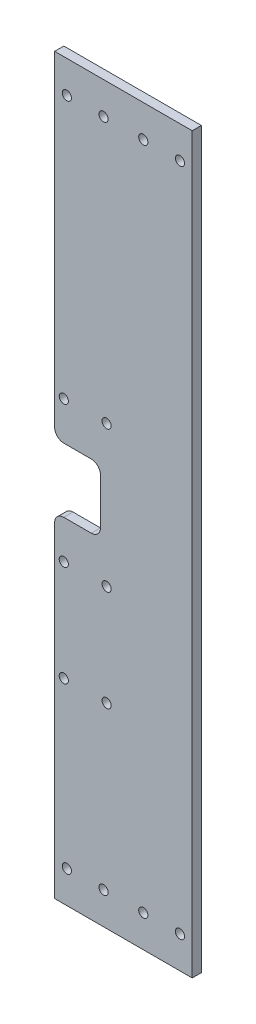
ISO-10303-21;
HEADER;
FILE_DESCRIPTION(('STEP AP214'),'2;1');
FILE_NAME('part.step','',(''),(''),'','','');
FILE_SCHEMA(('AUTOMOTIVE_DESIGN { 1 0 10303 214 1 1 1 1 }'));
ENDSEC;
DATA;
#1=APPLICATION_CONTEXT('core data for automotive mechanical design processes');
#2=APPLICATION_PROTOCOL_DEFINITION('international standard','automotive_design',2000,#1);
#3=PRODUCT_CONTEXT('',#1,'mechanical');
#4=PRODUCT('Part','Part','',(#3));
#5=PRODUCT_RELATED_PRODUCT_CATEGORY('part','',(#4));
#6=PRODUCT_DEFINITION_FORMATION('','',#4);
#7=PRODUCT_DEFINITION_CONTEXT('part definition',#1,'design');
#8=PRODUCT_DEFINITION('design','',#6,#7);
#9=PRODUCT_DEFINITION_SHAPE('','',#8);
#10=(LENGTH_UNIT() NAMED_UNIT(*) SI_UNIT(.MILLI.,.METRE.));
#11=(NAMED_UNIT(*) PLANE_ANGLE_UNIT() SI_UNIT($,.RADIAN.));
#12=(NAMED_UNIT(*) SI_UNIT($,.STERADIAN.) SOLID_ANGLE_UNIT());
#13=UNCERTAINTY_MEASURE_WITH_UNIT(LENGTH_MEASURE(1.E-05),#10,'distance_accuracy_value','');
#14=(GEOMETRIC_REPRESENTATION_CONTEXT(3) GLOBAL_UNCERTAINTY_ASSIGNED_CONTEXT((#13)) GLOBAL_UNIT_ASSIGNED_CONTEXT((#10,
#11,#12)) REPRESENTATION_CONTEXT('',''));
#15=CARTESIAN_POINT('',(0.,0.,0.));
#16=DIRECTION('',(0.,0.,1.));
#17=DIRECTION('',(1.,0.,0.));
#18=AXIS2_PLACEMENT_3D('',#15,#16,#17);
#19=CARTESIAN_POINT('',(2767.51034317599,-6.92406468480509E-11,3.));
#20=DIRECTION('',(1.,0.,0.));
#21=DIRECTION('',(0.,1.,0.));
#22=AXIS2_PLACEMENT_3D('',#19,#20,#21);
#23=PLANE('',#22);
#24=DIRECTION('',(0.,-1.,0.));
#25=VECTOR('',#24,1.);
#26=CARTESIAN_POINT('',(2767.51034317599,-6.92406468480509E-11,0.));
#27=LINE('',#26,#25);
#28=CARTESIAN_POINT('',(2767.51034317604,1970.7187101528,0.));
#29=VERTEX_POINT('',#28);
#30=CARTESIAN_POINT('',(2767.51034317604,1864.2187101528,0.));
#31=VERTEX_POINT('',#30);
#32=EDGE_CURVE('E195',#29,#31,#27,.T.);
#33=ORIENTED_EDGE('',*,*,#32,.T.);
#34=DIRECTION('',(0.,0.,-1.));
#35=VECTOR('',#34,1.);
#36=CARTESIAN_POINT('',(2767.51034317604,1864.2187101528,3.));
#37=LINE('',#36,#35);
#38=CARTESIAN_POINT('',(2767.51034317604,1864.2187101528,3.));
#39=VERTEX_POINT('',#38);
#40=EDGE_CURVE('E11',#39,#31,#37,.T.);
#41=ORIENTED_EDGE('',*,*,#40,.F.);
#42=DIRECTION('',(0.,-1.,0.));
#43=VECTOR('',#42,1.);
#44=CARTESIAN_POINT('',(2767.51034317599,-6.92406468480509E-11,3.));
#45=LINE('',#44,#43);
#46=CARTESIAN_POINT('',(2767.51034317604,1970.7187101528,3.));
#47=VERTEX_POINT('',#46);
#48=EDGE_CURVE('E289',#47,#39,#45,.T.);
#49=ORIENTED_EDGE('',*,*,#48,.F.);
#50=DIRECTION('',(0.,0.,-1.));
#51=VECTOR('',#50,1.);
#52=CARTESIAN_POINT('',(2767.51034317604,1970.7187101528,3.));
#53=LINE('',#52,#51);
#54=EDGE_CURVE('E53',#47,#29,#53,.T.);
#55=ORIENTED_EDGE('',*,*,#54,.T.);
#56=EDGE_LOOP('',(#33,#41,#49,#55));
#57=FACE_BOUND('',#56,.T.);
#58=ADVANCED_FACE('F34',(#57),#23,.F.);
#59=CARTESIAN_POINT('',(2770.51034317604,1864.2187101528,3.));
#60=DIRECTION('',(0.,0.,-1.));
#61=DIRECTION('',(-1.,0.,0.));
#62=AXIS2_PLACEMENT_3D('',#59,#60,#61);
#63=CYLINDRICAL_SURFACE('',#62,2.99999999999978);
#64=CARTESIAN_POINT('',(2770.51034317604,1864.2187101528,0.));
#65=DIRECTION('',(0.,0.,1.));
#66=DIRECTION('',(1.,0.,0.));
#67=AXIS2_PLACEMENT_3D('',#64,#65,#66);
#68=CIRCLE('',#67,2.99999999999978);
#69=CARTESIAN_POINT('',(2770.51034317604,1861.2187101528,0.));
#70=VERTEX_POINT('',#69);
#71=EDGE_CURVE('E197',#31,#70,#68,.T.);
#72=ORIENTED_EDGE('',*,*,#71,.T.);
#73=DIRECTION('',(0.,0.,-1.));
#74=VECTOR('',#73,1.);
#75=CARTESIAN_POINT('',(2770.51034317604,1861.2187101528,3.));
#76=LINE('',#75,#74);
#77=CARTESIAN_POINT('',(2770.51034317604,1861.2187101528,3.));
#78=VERTEX_POINT('',#77);
#79=EDGE_CURVE('E44',#78,#70,#76,.T.);
#80=ORIENTED_EDGE('',*,*,#79,.F.);
#81=CARTESIAN_POINT('',(2770.51034317604,1864.2187101528,3.));
#82=DIRECTION('',(0.,0.,1.));
#83=DIRECTION('',(1.,0.,0.));
#84=AXIS2_PLACEMENT_3D('',#81,#82,#83);
#85=CIRCLE('',#84,2.99999999999978);
#86=EDGE_CURVE('E103',#39,#78,#85,.T.);
#87=ORIENTED_EDGE('',*,*,#86,.F.);
#88=ORIENTED_EDGE('',*,*,#40,.T.);
#89=EDGE_LOOP('',(#72,#80,#87,#88));
#90=FACE_BOUND('',#89,.T.);
#91=ADVANCED_FACE('F333',(#90),#63,.T.);
#92=CARTESIAN_POINT('',(0.,1861.2187101528,3.));
#93=DIRECTION('',(0.,-1.,0.));
#94=DIRECTION('',(0.,0.,-1.));
#95=AXIS2_PLACEMENT_3D('',#92,#93,#94);
#96=PLANE('',#95);
#97=DIRECTION('',(-1.,0.,0.));
#98=VECTOR('',#97,1.);
#99=CARTESIAN_POINT('',(0.,1861.2187101528,0.));
#100=LINE('',#99,#98);
#101=CARTESIAN_POINT('',(2779.51034317604,1861.2187101528,0.));
#102=VERTEX_POINT('',#101);
#103=EDGE_CURVE('E200',#102,#70,#100,.T.);
#104=ORIENTED_EDGE('',*,*,#103,.F.);
#105=DIRECTION('',(0.,0.,-1.));
#106=VECTOR('',#105,1.);
#107=CARTESIAN_POINT('',(2779.51034317604,1861.2187101528,3.));
#108=LINE('',#107,#106);
#109=CARTESIAN_POINT('',(2779.51034317604,1861.2187101528,3.));
#110=VERTEX_POINT('',#109);
#111=EDGE_CURVE('E240',#110,#102,#108,.T.);
#112=ORIENTED_EDGE('',*,*,#111,.F.);
#113=DIRECTION('',(-1.,0.,0.));
#114=VECTOR('',#113,1.);
#115=CARTESIAN_POINT('',(0.,1861.2187101528,3.));
#116=LINE('',#115,#114);
#117=EDGE_CURVE('E292',#110,#78,#116,.T.);
#118=ORIENTED_EDGE('',*,*,#117,.T.);
#119=ORIENTED_EDGE('',*,*,#79,.T.);
#120=EDGE_LOOP('',(#104,#112,#118,#119));
#121=FACE_BOUND('',#120,.T.);
#122=ADVANCED_FACE('F338',(#121),#96,.T.);
#123=CARTESIAN_POINT('',(2779.51034317604,1858.2187101528,3.));
#124=DIRECTION('',(0.,0.,-1.));
#125=DIRECTION('',(-1.,0.,0.));
#126=AXIS2_PLACEMENT_3D('',#123,#124,#125);
#127=CYLINDRICAL_SURFACE('',#126,3.00000000000011);
#128=CARTESIAN_POINT('',(2779.51034317604,1858.2187101528,0.));
#129=DIRECTION('',(0.,0.,1.));
#130=DIRECTION('',(1.,0.,0.));
#131=AXIS2_PLACEMENT_3D('',#128,#129,#130);
#132=CIRCLE('',#131,3.00000000000011);
#133=CARTESIAN_POINT('',(2782.51034317604,1858.2187101528,0.));
#134=VERTEX_POINT('',#133);
#135=EDGE_CURVE('E203',#134,#102,#132,.T.);
#136=ORIENTED_EDGE('',*,*,#135,.F.);
#137=DIRECTION('',(0.,0.,-1.));
#138=VECTOR('',#137,1.);
#139=CARTESIAN_POINT('',(2782.51034317604,1858.2187101528,3.));
#140=LINE('',#139,#138);
#141=CARTESIAN_POINT('',(2782.51034317604,1858.2187101528,3.));
#142=VERTEX_POINT('',#141);
#143=EDGE_CURVE('E238',#142,#134,#140,.T.);
#144=ORIENTED_EDGE('',*,*,#143,.F.);
#145=CARTESIAN_POINT('',(2779.51034317604,1858.2187101528,3.));
#146=DIRECTION('',(0.,0.,1.));
#147=DIRECTION('',(1.,0.,0.));
#148=AXIS2_PLACEMENT_3D('',#145,#146,#147);
#149=CIRCLE('',#148,3.00000000000011);
#150=EDGE_CURVE('E295',#142,#110,#149,.T.);
#151=ORIENTED_EDGE('',*,*,#150,.T.);
#152=ORIENTED_EDGE('',*,*,#111,.T.);
#153=EDGE_LOOP('',(#136,#144,#151,#152));
#154=FACE_BOUND('',#153,.T.);
#155=ADVANCED_FACE('F617',(#154),#127,.F.);
#156=CARTESIAN_POINT('',(2782.51034317604,0.,3.));
#157=DIRECTION('',(1.,0.,0.));
#158=DIRECTION('',(0.,0.,-1.));
#159=AXIS2_PLACEMENT_3D('',#156,#157,#158);
#160=PLANE('',#159);
#161=DIRECTION('',(0.,-1.,0.));
#162=VECTOR('',#161,1.);
#163=CARTESIAN_POINT('',(2782.51034317604,0.,0.));
#164=LINE('',#163,#162);
#165=CARTESIAN_POINT('',(2782.51034317604,1843.2187101528,0.));
#166=VERTEX_POINT('',#165);
#167=EDGE_CURVE('E206',#134,#166,#164,.T.);
#168=ORIENTED_EDGE('',*,*,#167,.T.);
#169=DIRECTION('',(0.,0.,-1.));
#170=VECTOR('',#169,1.);
#171=CARTESIAN_POINT('',(2782.51034317604,1843.2187101528,3.));
#172=LINE('',#171,#170);
#173=CARTESIAN_POINT('',(2782.51034317604,1843.2187101528,3.));
#174=VERTEX_POINT('',#173);
#175=EDGE_CURVE('E236',#174,#166,#172,.T.);
#176=ORIENTED_EDGE('',*,*,#175,.F.);
#177=DIRECTION('',(0.,-1.,0.));
#178=VECTOR('',#177,1.);
#179=CARTESIAN_POINT('',(2782.51034317604,0.,3.));
#180=LINE('',#179,#178);
#181=EDGE_CURVE('E298',#142,#174,#180,.T.);
#182=ORIENTED_EDGE('',*,*,#181,.F.);
#183=ORIENTED_EDGE('',*,*,#143,.T.);
#184=EDGE_LOOP('',(#168,#176,#182,#183));
#185=FACE_BOUND('',#184,.T.);
#186=ADVANCED_FACE('F607',(#185),#160,.F.);
#187=CARTESIAN_POINT('',(2779.51034317604,1843.2187101528,3.));
#188=DIRECTION('',(0.,0.,-1.));
#189=DIRECTION('',(-1.,0.,0.));
#190=AXIS2_PLACEMENT_3D('',#187,#188,#189);
#191=CYLINDRICAL_SURFACE('',#190,3.00000000000011);
#192=CARTESIAN_POINT('',(2779.51034317604,1843.2187101528,0.));
#193=DIRECTION('',(0.,0.,1.));
#194=DIRECTION('',(1.,0.,0.));
#195=AXIS2_PLACEMENT_3D('',#192,#193,#194);
#196=CIRCLE('',#195,3.00000000000011);
#197=CARTESIAN_POINT('',(2779.51034317604,1840.2187101528,0.));
#198=VERTEX_POINT('',#197);
#199=EDGE_CURVE('E209',#198,#166,#196,.T.);
#200=ORIENTED_EDGE('',*,*,#199,.F.);
#201=DIRECTION('',(0.,0.,-1.));
#202=VECTOR('',#201,1.);
#203=CARTESIAN_POINT('',(2779.51034317604,1840.2187101528,3.));
#204=LINE('',#203,#202);
#205=CARTESIAN_POINT('',(2779.51034317604,1840.2187101528,3.));
#206=VERTEX_POINT('',#205);
#207=EDGE_CURVE('E234',#206,#198,#204,.T.);
#208=ORIENTED_EDGE('',*,*,#207,.F.);
#209=CARTESIAN_POINT('',(2779.51034317604,1843.2187101528,3.));
#210=DIRECTION('',(0.,0.,1.));
#211=DIRECTION('',(1.,0.,0.));
#212=AXIS2_PLACEMENT_3D('',#209,#210,#211);
#213=CIRCLE('',#212,3.00000000000011);
#214=EDGE_CURVE('E300',#206,#174,#213,.T.);
#215=ORIENTED_EDGE('',*,*,#214,.T.);
#216=ORIENTED_EDGE('',*,*,#175,.T.);
#217=EDGE_LOOP('',(#200,#208,#215,#216));
#218=FACE_BOUND('',#217,.T.);
#219=ADVANCED_FACE('F597',(#218),#191,.F.);
#220=CARTESIAN_POINT('',(0.,1840.2187101528,3.));
#221=DIRECTION('',(0.,-1.,0.));
#222=DIRECTION('',(0.,0.,-1.));
#223=AXIS2_PLACEMENT_3D('',#220,#221,#222);
#224=PLANE('',#223);
#225=DIRECTION('',(-1.,0.,0.));
#226=VECTOR('',#225,1.);
#227=CARTESIAN_POINT('',(0.,1840.2187101528,0.));
#228=LINE('',#227,#226);
#229=CARTESIAN_POINT('',(2770.51034317604,1840.2187101528,0.));
#230=VERTEX_POINT('',#229);
#231=EDGE_CURVE('E212',#198,#230,#228,.T.);
#232=ORIENTED_EDGE('',*,*,#231,.T.);
#233=DIRECTION('',(0.,0.,-1.));
#234=VECTOR('',#233,1.);
#235=CARTESIAN_POINT('',(2770.51034317604,1840.2187101528,3.));
#236=LINE('',#235,#234);
#237=CARTESIAN_POINT('',(2770.51034317604,1840.2187101528,3.));
#238=VERTEX_POINT('',#237);
#239=EDGE_CURVE('E231',#238,#230,#236,.T.);
#240=ORIENTED_EDGE('',*,*,#239,.F.);
#241=DIRECTION('',(-1.,0.,0.));
#242=VECTOR('',#241,1.);
#243=CARTESIAN_POINT('',(0.,1840.2187101528,3.));
#244=LINE('',#243,#242);
#245=EDGE_CURVE('E303',#206,#238,#244,.T.);
#246=ORIENTED_EDGE('',*,*,#245,.F.);
#247=ORIENTED_EDGE('',*,*,#207,.T.);
#248=EDGE_LOOP('',(#232,#240,#246,#247));
#249=FACE_BOUND('',#248,.T.);
#250=ADVANCED_FACE('F588',(#249),#224,.F.);
#251=CARTESIAN_POINT('',(2770.51034317604,1837.2187101528,3.));
#252=DIRECTION('',(0.,0.,-1.));
#253=DIRECTION('',(-1.,0.,0.));
#254=AXIS2_PLACEMENT_3D('',#251,#252,#253);
#255=CYLINDRICAL_SURFACE('',#254,2.99999999999978);
#256=CARTESIAN_POINT('',(2770.51034317604,1837.2187101528,0.));
#257=DIRECTION('',(0.,0.,1.));
#258=DIRECTION('',(1.,0.,0.));
#259=AXIS2_PLACEMENT_3D('',#256,#257,#258);
#260=CIRCLE('',#259,2.99999999999978);
#261=CARTESIAN_POINT('',(2767.51034317604,1837.2187101528,0.));
#262=VERTEX_POINT('',#261);
#263=EDGE_CURVE('E214',#230,#262,#260,.T.);
#264=ORIENTED_EDGE('',*,*,#263,.T.);
#265=DIRECTION('',(0.,0.,-1.));
#266=VECTOR('',#265,1.);
#267=CARTESIAN_POINT('',(2767.51034317604,1837.2187101528,3.));
#268=LINE('',#267,#266);
#269=CARTESIAN_POINT('',(2767.51034317604,1837.2187101528,3.));
#270=VERTEX_POINT('',#269);
#271=EDGE_CURVE('E228',#270,#262,#268,.T.);
#272=ORIENTED_EDGE('',*,*,#271,.F.);
#273=CARTESIAN_POINT('',(2770.51034317604,1837.2187101528,3.));
#274=DIRECTION('',(0.,0.,1.));
#275=DIRECTION('',(1.,0.,0.));
#276=AXIS2_PLACEMENT_3D('',#273,#274,#275);
#277=CIRCLE('',#276,2.99999999999978);
#278=EDGE_CURVE('E305',#238,#270,#277,.T.);
#279=ORIENTED_EDGE('',*,*,#278,.F.);
#280=ORIENTED_EDGE('',*,*,#239,.T.);
#281=EDGE_LOOP('',(#264,#272,#279,#280));
#282=FACE_BOUND('',#281,.T.);
#283=ADVANCED_FACE('F312',(#282),#255,.T.);
#284=CARTESIAN_POINT('',(2767.51034317599,-8.07807546560591E-11,3.));
#285=DIRECTION('',(1.,0.,0.));
#286=DIRECTION('',(0.,1.,0.));
#287=AXIS2_PLACEMENT_3D('',#284,#285,#286);
#288=PLANE('',#287);
#289=DIRECTION('',(0.,-1.,0.));
#290=VECTOR('',#289,1.);
#291=CARTESIAN_POINT('',(2767.51034317599,-8.07807546560591E-11,0.));
#292=LINE('',#291,#290);
#293=CARTESIAN_POINT('',(2767.51034317604,1730.7187101528,0.));
#294=VERTEX_POINT('',#293);
#295=EDGE_CURVE('E216',#262,#294,#292,.T.);
#296=ORIENTED_EDGE('',*,*,#295,.T.);
#297=DIRECTION('',(0.,0.,-1.));
#298=VECTOR('',#297,1.);
#299=CARTESIAN_POINT('',(2767.51034317604,1730.7187101528,3.));
#300=LINE('',#299,#298);
#301=CARTESIAN_POINT('',(2767.51034317604,1730.7187101528,3.));
#302=VERTEX_POINT('',#301);
#303=EDGE_CURVE('E150',#302,#294,#300,.T.);
#304=ORIENTED_EDGE('',*,*,#303,.F.);
#305=DIRECTION('',(0.,-1.,0.));
#306=VECTOR('',#305,1.);
#307=CARTESIAN_POINT('',(2767.51034317599,-8.07807546560591E-11,3.));
#308=LINE('',#307,#306);
#309=EDGE_CURVE('E138',#270,#302,#308,.T.);
#310=ORIENTED_EDGE('',*,*,#309,.F.);
#311=ORIENTED_EDGE('',*,*,#271,.T.);
#312=EDGE_LOOP('',(#296,#304,#310,#311));
#313=FACE_BOUND('',#312,.T.);
#314=ADVANCED_FACE('F316',(#313),#288,.F.);
#315=CARTESIAN_POINT('',(0.,1730.7187101528,3.));
#316=DIRECTION('',(0.,1.,0.));
#317=DIRECTION('',(0.,0.,1.));
#318=AXIS2_PLACEMENT_3D('',#315,#316,#317);
#319=PLANE('',#318);
#320=DIRECTION('',(1.,0.,0.));
#321=VECTOR('',#320,1.);
#322=CARTESIAN_POINT('',(0.,1730.7187101528,0.));
#323=LINE('',#322,#321);
#324=CARTESIAN_POINT('',(2812.51034317604,1730.7187101528,0.));
#325=VERTEX_POINT('',#324);
#326=EDGE_CURVE('E147',#294,#325,#323,.T.);
#327=ORIENTED_EDGE('',*,*,#326,.T.);
#328=DIRECTION('',(0.,0.,-1.));
#329=VECTOR('',#328,1.);
#330=CARTESIAN_POINT('',(2812.51034317604,1730.7187101528,3.));
#331=LINE('',#330,#329);
#332=CARTESIAN_POINT('',(2812.51034317604,1730.7187101528,3.));
#333=VERTEX_POINT('',#332);
#334=EDGE_CURVE('E144',#333,#325,#331,.T.);
#335=ORIENTED_EDGE('',*,*,#334,.F.);
#336=DIRECTION('',(1.,0.,0.));
#337=VECTOR('',#336,1.);
#338=CARTESIAN_POINT('',(0.,1730.7187101528,3.));
#339=LINE('',#338,#337);
#340=EDGE_CURVE('E131',#302,#333,#339,.T.);
#341=ORIENTED_EDGE('',*,*,#340,.F.);
#342=ORIENTED_EDGE('',*,*,#303,.T.);
#343=EDGE_LOOP('',(#327,#335,#341,#342));
#344=FACE_BOUND('',#343,.T.);
#345=ADVANCED_FACE('F145',(#344),#319,.F.);
#346=CARTESIAN_POINT('',(2812.51034317604,0.,3.));
#347=DIRECTION('',(1.,0.,0.));
#348=DIRECTION('',(0.,0.,-1.));
#349=AXIS2_PLACEMENT_3D('',#346,#347,#348);
#350=PLANE('',#349);
#351=DIRECTION('',(0.,-1.,0.));
#352=VECTOR('',#351,1.);
#353=CARTESIAN_POINT('',(2812.51034317604,0.,0.));
#354=LINE('',#353,#352);
#355=CARTESIAN_POINT('',(2812.51034317604,1970.7187101528,0.));
#356=VERTEX_POINT('',#355);
#357=EDGE_CURVE('E219',#356,#325,#354,.T.);
#358=ORIENTED_EDGE('',*,*,#357,.F.);
#359=DIRECTION('',(0.,0.,-1.));
#360=VECTOR('',#359,1.);
#361=CARTESIAN_POINT('',(2812.51034317604,1970.7187101528,3.));
#362=LINE('',#361,#360);
#363=CARTESIAN_POINT('',(2812.51034317604,1970.7187101528,3.));
#364=VERTEX_POINT('',#363);
#365=EDGE_CURVE('E91',#364,#356,#362,.T.);
#366=ORIENTED_EDGE('',*,*,#365,.F.);
#367=DIRECTION('',(0.,-1.,0.));
#368=VECTOR('',#367,1.);
#369=CARTESIAN_POINT('',(2812.51034317604,0.,3.));
#370=LINE('',#369,#368);
#371=EDGE_CURVE('E136',#364,#333,#370,.T.);
#372=ORIENTED_EDGE('',*,*,#371,.T.);
#373=ORIENTED_EDGE('',*,*,#334,.T.);
#374=EDGE_LOOP('',(#358,#366,#372,#373));
#375=FACE_BOUND('',#374,.T.);
#376=ADVANCED_FACE('F152',(#375),#350,.T.);
#377=CARTESIAN_POINT('',(2808.51034317604,1741.2187101528,3.));
#378=DIRECTION('',(0.,0.,-1.));
#379=DIRECTION('',(-1.,0.,0.));
#380=AXIS2_PLACEMENT_3D('',#377,#378,#379);
#381=CYLINDRICAL_SURFACE('',#380,1.50000000000006);
#382=CARTESIAN_POINT('',(2808.51034317604,1741.2187101528,3.));
#383=DIRECTION('',(0.,0.,1.));
#384=DIRECTION('',(1.,0.,0.));
#385=AXIS2_PLACEMENT_3D('',#382,#383,#384);
#386=CIRCLE('',#385,1.50000000000006);
#387=CARTESIAN_POINT('',(2810.01034317604,1741.2187101528,3.));
#388=VERTEX_POINT('',#387);
#389=EDGE_CURVE('E286',#388,#388,#386,.T.);
#390=ORIENTED_EDGE('',*,*,#389,.T.);
#391=EDGE_LOOP('',(#390));
#392=FACE_BOUND('',#391,.T.);
#393=CARTESIAN_POINT('',(2808.51034317604,1741.2187101528,0.));
#394=DIRECTION('',(0.,0.,1.));
#395=DIRECTION('',(1.,0.,0.));
#396=AXIS2_PLACEMENT_3D('',#393,#394,#395);
#397=CIRCLE('',#396,1.50000000000006);
#398=CARTESIAN_POINT('',(2810.01034317604,1741.2187101528,0.));
#399=VERTEX_POINT('',#398);
#400=EDGE_CURVE('E192',#399,#399,#397,.T.);
#401=ORIENTED_EDGE('',*,*,#400,.F.);
#402=EDGE_LOOP('',(#401));
#403=FACE_BOUND('',#402,.T.);
#404=ADVANCED_FACE('F342',(#392,#403),#381,.F.);
#405=CARTESIAN_POINT('',(2796.51034317604,1741.2187101528,3.));
#406=DIRECTION('',(0.,0.,-1.));
#407=DIRECTION('',(-1.,0.,0.));
#408=AXIS2_PLACEMENT_3D('',#405,#406,#407);
#409=CYLINDRICAL_SURFACE('',#408,1.50000000000006);
#410=CARTESIAN_POINT('',(2796.51034317604,1741.2187101528,3.));
#411=DIRECTION('',(0.,0.,1.));
#412=DIRECTION('',(1.,0.,0.));
#413=AXIS2_PLACEMENT_3D('',#410,#411,#412);
#414=CIRCLE('',#413,1.50000000000006);
#415=CARTESIAN_POINT('',(2798.01034317604,1741.2187101528,3.));
#416=VERTEX_POINT('',#415);
#417=EDGE_CURVE('E283',#416,#416,#414,.T.);
#418=ORIENTED_EDGE('',*,*,#417,.T.);
#419=EDGE_LOOP('',(#418));
#420=FACE_BOUND('',#419,.T.);
#421=CARTESIAN_POINT('',(2796.51034317604,1741.2187101528,0.));
#422=DIRECTION('',(0.,0.,1.));
#423=DIRECTION('',(1.,0.,0.));
#424=AXIS2_PLACEMENT_3D('',#421,#422,#423);
#425=CIRCLE('',#424,1.50000000000006);
#426=CARTESIAN_POINT('',(2798.01034317604,1741.2187101528,0.));
#427=VERTEX_POINT('',#426);
#428=EDGE_CURVE('E189',#427,#427,#425,.T.);
#429=ORIENTED_EDGE('',*,*,#428,.F.);
#430=EDGE_LOOP('',(#429));
#431=FACE_BOUND('',#430,.T.);
#432=ADVANCED_FACE('F345',(#420,#431),#409,.F.);
#433=CARTESIAN_POINT('',(2783.51034317604,1741.2187101528,3.));
#434=DIRECTION('',(0.,0.,-1.));
#435=DIRECTION('',(-1.,0.,0.));
#436=AXIS2_PLACEMENT_3D('',#433,#434,#435);
#437=CYLINDRICAL_SURFACE('',#436,1.50000000000006);
#438=CARTESIAN_POINT('',(2783.51034317604,1741.2187101528,3.));
#439=DIRECTION('',(0.,0.,1.));
#440=DIRECTION('',(1.,0.,0.));
#441=AXIS2_PLACEMENT_3D('',#438,#439,#440);
#442=CIRCLE('',#441,1.50000000000006);
#443=CARTESIAN_POINT('',(2785.01034317604,1741.2187101528,3.));
#444=VERTEX_POINT('',#443);
#445=EDGE_CURVE('E280',#444,#444,#442,.T.);
#446=ORIENTED_EDGE('',*,*,#445,.T.);
#447=EDGE_LOOP('',(#446));
#448=FACE_BOUND('',#447,.T.);
#449=CARTESIAN_POINT('',(2783.51034317604,1741.2187101528,0.));
#450=DIRECTION('',(0.,0.,1.));
#451=DIRECTION('',(1.,0.,0.));
#452=AXIS2_PLACEMENT_3D('',#449,#450,#451);
#453=CIRCLE('',#452,1.50000000000006);
#454=CARTESIAN_POINT('',(2785.01034317604,1741.2187101528,0.));
#455=VERTEX_POINT('',#454);
#456=EDGE_CURVE('E186',#455,#455,#453,.T.);
#457=ORIENTED_EDGE('',*,*,#456,.F.);
#458=EDGE_LOOP('',(#457));
#459=FACE_BOUND('',#458,.T.);
#460=ADVANCED_FACE('F349',(#448,#459),#437,.F.);
#461=CARTESIAN_POINT('',(2771.51034317604,1741.2187101528,3.));
#462=DIRECTION('',(0.,0.,-1.));
#463=DIRECTION('',(-1.,0.,0.));
#464=AXIS2_PLACEMENT_3D('',#461,#462,#463);
#465=CYLINDRICAL_SURFACE('',#464,1.50000000000006);
#466=CARTESIAN_POINT('',(2771.51034317604,1741.2187101528,3.));
#467=DIRECTION('',(0.,0.,1.));
#468=DIRECTION('',(1.,0.,0.));
#469=AXIS2_PLACEMENT_3D('',#466,#467,#468);
#470=CIRCLE('',#469,1.50000000000006);
#471=CARTESIAN_POINT('',(2773.01034317604,1741.2187101528,3.));
#472=VERTEX_POINT('',#471);
#473=EDGE_CURVE('E277',#472,#472,#470,.T.);
#474=ORIENTED_EDGE('',*,*,#473,.T.);
#475=EDGE_LOOP('',(#474));
#476=FACE_BOUND('',#475,.T.);
#477=CARTESIAN_POINT('',(2771.51034317604,1741.2187101528,0.));
#478=DIRECTION('',(0.,0.,1.));
#479=DIRECTION('',(1.,0.,0.));
#480=AXIS2_PLACEMENT_3D('',#477,#478,#479);
#481=CIRCLE('',#480,1.50000000000006);
#482=CARTESIAN_POINT('',(2773.01034317604,1741.2187101528,0.));
#483=VERTEX_POINT('',#482);
#484=EDGE_CURVE('E183',#483,#483,#481,.T.);
#485=ORIENTED_EDGE('',*,*,#484,.F.);
#486=EDGE_LOOP('',(#485));
#487=FACE_BOUND('',#486,.T.);
#488=ADVANCED_FACE('F353',(#476,#487),#465,.F.);
#489=CARTESIAN_POINT('',(2808.51034317604,1960.2187101528,3.));
#490=DIRECTION('',(0.,0.,-1.));
#491=DIRECTION('',(-1.,0.,0.));
#492=AXIS2_PLACEMENT_3D('',#489,#490,#491);
#493=CYLINDRICAL_SURFACE('',#492,1.50000000000006);
#494=CARTESIAN_POINT('',(2808.51034317604,1960.2187101528,3.));
#495=DIRECTION('',(0.,0.,1.));
#496=DIRECTION('',(1.,0.,0.));
#497=AXIS2_PLACEMENT_3D('',#494,#495,#496);
#498=CIRCLE('',#497,1.50000000000006);
#499=CARTESIAN_POINT('',(2810.01034317604,1960.2187101528,3.));
#500=VERTEX_POINT('',#499);
#501=EDGE_CURVE('E274',#500,#500,#498,.T.);
#502=ORIENTED_EDGE('',*,*,#501,.T.);
#503=EDGE_LOOP('',(#502));
#504=FACE_BOUND('',#503,.T.);
#505=CARTESIAN_POINT('',(2808.51034317604,1960.2187101528,0.));
#506=DIRECTION('',(0.,0.,1.));
#507=DIRECTION('',(1.,0.,0.));
#508=AXIS2_PLACEMENT_3D('',#505,#506,#507);
#509=CIRCLE('',#508,1.50000000000006);
#510=CARTESIAN_POINT('',(2810.01034317604,1960.2187101528,0.));
#511=VERTEX_POINT('',#510);
#512=EDGE_CURVE('E180',#511,#511,#509,.T.);
#513=ORIENTED_EDGE('',*,*,#512,.F.);
#514=EDGE_LOOP('',(#513));
#515=FACE_BOUND('',#514,.T.);
#516=ADVANCED_FACE('F357',(#504,#515),#493,.F.);
#517=CARTESIAN_POINT('',(2796.51034317604,1960.2187101528,3.));
#518=DIRECTION('',(0.,0.,-1.));
#519=DIRECTION('',(-1.,0.,0.));
#520=AXIS2_PLACEMENT_3D('',#517,#518,#519);
#521=CYLINDRICAL_SURFACE('',#520,1.50000000000006);
#522=CARTESIAN_POINT('',(2796.51034317604,1960.2187101528,3.));
#523=DIRECTION('',(0.,0.,1.));
#524=DIRECTION('',(1.,0.,0.));
#525=AXIS2_PLACEMENT_3D('',#522,#523,#524);
#526=CIRCLE('',#525,1.50000000000006);
#527=CARTESIAN_POINT('',(2798.01034317604,1960.2187101528,3.));
#528=VERTEX_POINT('',#527);
#529=EDGE_CURVE('E271',#528,#528,#526,.T.);
#530=ORIENTED_EDGE('',*,*,#529,.T.);
#531=EDGE_LOOP('',(#530));
#532=FACE_BOUND('',#531,.T.);
#533=CARTESIAN_POINT('',(2796.51034317604,1960.2187101528,0.));
#534=DIRECTION('',(0.,0.,1.));
#535=DIRECTION('',(1.,0.,0.));
#536=AXIS2_PLACEMENT_3D('',#533,#534,#535);
#537=CIRCLE('',#536,1.50000000000006);
#538=CARTESIAN_POINT('',(2798.01034317604,1960.2187101528,0.));
#539=VERTEX_POINT('',#538);
#540=EDGE_CURVE('E177',#539,#539,#537,.T.);
#541=ORIENTED_EDGE('',*,*,#540,.F.);
#542=EDGE_LOOP('',(#541));
#543=FACE_BOUND('',#542,.T.);
#544=ADVANCED_FACE('F361',(#532,#543),#521,.F.);
#545=CARTESIAN_POINT('',(2783.51034317604,1960.2187101528,3.));
#546=DIRECTION('',(0.,0.,-1.));
#547=DIRECTION('',(-1.,0.,0.));
#548=AXIS2_PLACEMENT_3D('',#545,#546,#547);
#549=CYLINDRICAL_SURFACE('',#548,1.50000000000006);
#550=CARTESIAN_POINT('',(2783.51034317604,1960.2187101528,3.));
#551=DIRECTION('',(0.,0.,1.));
#552=DIRECTION('',(1.,0.,0.));
#553=AXIS2_PLACEMENT_3D('',#550,#551,#552);
#554=CIRCLE('',#553,1.50000000000006);
#555=CARTESIAN_POINT('',(2785.01034317604,1960.2187101528,3.));
#556=VERTEX_POINT('',#555);
#557=EDGE_CURVE('E268',#556,#556,#554,.T.);
#558=ORIENTED_EDGE('',*,*,#557,.T.);
#559=EDGE_LOOP('',(#558));
#560=FACE_BOUND('',#559,.T.);
#561=CARTESIAN_POINT('',(2783.51034317604,1960.2187101528,0.));
#562=DIRECTION('',(0.,0.,1.));
#563=DIRECTION('',(1.,0.,0.));
#564=AXIS2_PLACEMENT_3D('',#561,#562,#563);
#565=CIRCLE('',#564,1.50000000000006);
#566=CARTESIAN_POINT('',(2785.01034317604,1960.2187101528,0.));
#567=VERTEX_POINT('',#566);
#568=EDGE_CURVE('E174',#567,#567,#565,.T.);
#569=ORIENTED_EDGE('',*,*,#568,.F.);
#570=EDGE_LOOP('',(#569));
#571=FACE_BOUND('',#570,.T.);
#572=ADVANCED_FACE('F365',(#560,#571),#549,.F.);
#573=CARTESIAN_POINT('',(2771.51034317604,1960.2187101528,3.));
#574=DIRECTION('',(0.,0.,-1.));
#575=DIRECTION('',(-1.,0.,0.));
#576=AXIS2_PLACEMENT_3D('',#573,#574,#575);
#577=CYLINDRICAL_SURFACE('',#576,1.50000000000006);
#578=CARTESIAN_POINT('',(2771.51034317604,1960.2187101528,3.));
#579=DIRECTION('',(0.,0.,1.));
#580=DIRECTION('',(1.,0.,0.));
#581=AXIS2_PLACEMENT_3D('',#578,#579,#580);
#582=CIRCLE('',#581,1.50000000000006);
#583=CARTESIAN_POINT('',(2773.01034317604,1960.2187101528,3.));
#584=VERTEX_POINT('',#583);
#585=EDGE_CURVE('E265',#584,#584,#582,.T.);
#586=ORIENTED_EDGE('',*,*,#585,.T.);
#587=EDGE_LOOP('',(#586));
#588=FACE_BOUND('',#587,.T.);
#589=CARTESIAN_POINT('',(2771.51034317604,1960.2187101528,0.));
#590=DIRECTION('',(0.,0.,1.));
#591=DIRECTION('',(1.,0.,0.));
#592=AXIS2_PLACEMENT_3D('',#589,#590,#591);
#593=CIRCLE('',#592,1.50000000000006);
#594=CARTESIAN_POINT('',(2773.01034317604,1960.2187101528,0.));
#595=VERTEX_POINT('',#594);
#596=EDGE_CURVE('E171',#595,#595,#593,.T.);
#597=ORIENTED_EDGE('',*,*,#596,.F.);
#598=EDGE_LOOP('',(#597));
#599=FACE_BOUND('',#598,.T.);
#600=ADVANCED_FACE('F369',(#588,#599),#577,.F.);
#601=CARTESIAN_POINT('',(2784.51034317604,1873.8187101528,3.));
#602=DIRECTION('',(0.,0.,-1.));
#603=DIRECTION('',(-1.,0.,0.));
#604=AXIS2_PLACEMENT_3D('',#601,#602,#603);
#605=CYLINDRICAL_SURFACE('',#604,1.50000000000006);
#606=CARTESIAN_POINT('',(2784.51034317604,1873.8187101528,3.));
#607=DIRECTION('',(0.,0.,1.));
#608=DIRECTION('',(1.,0.,0.));
#609=AXIS2_PLACEMENT_3D('',#606,#607,#608);
#610=CIRCLE('',#609,1.50000000000006);
#611=CARTESIAN_POINT('',(2786.01034317604,1873.8187101528,3.));
#612=VERTEX_POINT('',#611);
#613=EDGE_CURVE('E262',#612,#612,#610,.T.);
#614=ORIENTED_EDGE('',*,*,#613,.T.);
#615=EDGE_LOOP('',(#614));
#616=FACE_BOUND('',#615,.T.);
#617=CARTESIAN_POINT('',(2784.51034317604,1873.8187101528,0.));
#618=DIRECTION('',(0.,0.,1.));
#619=DIRECTION('',(1.,0.,0.));
#620=AXIS2_PLACEMENT_3D('',#617,#618,#619);
#621=CIRCLE('',#620,1.50000000000006);
#622=CARTESIAN_POINT('',(2786.01034317604,1873.8187101528,0.));
#623=VERTEX_POINT('',#622);
#624=EDGE_CURVE('E168',#623,#623,#621,.T.);
#625=ORIENTED_EDGE('',*,*,#624,.F.);
#626=EDGE_LOOP('',(#625));
#627=FACE_BOUND('',#626,.T.);
#628=ADVANCED_FACE('F373',(#616,#627),#605,.F.);
#629=CARTESIAN_POINT('',(2770.51034317604,1873.8187101528,3.));
#630=DIRECTION('',(0.,0.,-1.));
#631=DIRECTION('',(-1.,0.,0.));
#632=AXIS2_PLACEMENT_3D('',#629,#630,#631);
#633=CYLINDRICAL_SURFACE('',#632,1.50000000000006);
#634=CARTESIAN_POINT('',(2770.51034317604,1873.8187101528,3.));
#635=DIRECTION('',(0.,0.,1.));
#636=DIRECTION('',(1.,0.,0.));
#637=AXIS2_PLACEMENT_3D('',#634,#635,#636);
#638=CIRCLE('',#637,1.50000000000006);
#639=CARTESIAN_POINT('',(2772.01034317604,1873.8187101528,3.));
#640=VERTEX_POINT('',#639);
#641=EDGE_CURVE('E259',#640,#640,#638,.T.);
#642=ORIENTED_EDGE('',*,*,#641,.T.);
#643=EDGE_LOOP('',(#642));
#644=FACE_BOUND('',#643,.T.);
#645=CARTESIAN_POINT('',(2770.51034317604,1873.8187101528,0.));
#646=DIRECTION('',(0.,0.,1.));
#647=DIRECTION('',(1.,0.,0.));
#648=AXIS2_PLACEMENT_3D('',#645,#646,#647);
#649=CIRCLE('',#648,1.50000000000006);
#650=CARTESIAN_POINT('',(2772.01034317604,1873.8187101528,0.));
#651=VERTEX_POINT('',#650);
#652=EDGE_CURVE('E165',#651,#651,#649,.T.);
#653=ORIENTED_EDGE('',*,*,#652,.F.);
#654=EDGE_LOOP('',(#653));
#655=FACE_BOUND('',#654,.T.);
#656=ADVANCED_FACE('F377',(#644,#655),#633,.F.);
#657=CARTESIAN_POINT('',(2770.51034317604,1827.6187101528,3.));
#658=DIRECTION('',(0.,0.,-1.));
#659=DIRECTION('',(-1.,0.,0.));
#660=AXIS2_PLACEMENT_3D('',#657,#658,#659);
#661=CYLINDRICAL_SURFACE('',#660,1.50000000000006);
#662=CARTESIAN_POINT('',(2770.51034317604,1827.6187101528,3.));
#663=DIRECTION('',(0.,0.,1.));
#664=DIRECTION('',(1.,0.,0.));
#665=AXIS2_PLACEMENT_3D('',#662,#663,#664);
#666=CIRCLE('',#665,1.50000000000006);
#667=CARTESIAN_POINT('',(2772.01034317604,1827.6187101528,3.));
#668=VERTEX_POINT('',#667);
#669=EDGE_CURVE('E256',#668,#668,#666,.T.);
#670=ORIENTED_EDGE('',*,*,#669,.T.);
#671=EDGE_LOOP('',(#670));
#672=FACE_BOUND('',#671,.T.);
#673=CARTESIAN_POINT('',(2770.51034317604,1827.6187101528,0.));
#674=DIRECTION('',(0.,0.,1.));
#675=DIRECTION('',(1.,0.,0.));
#676=AXIS2_PLACEMENT_3D('',#673,#674,#675);
#677=CIRCLE('',#676,1.50000000000006);
#678=CARTESIAN_POINT('',(2772.01034317604,1827.6187101528,0.));
#679=VERTEX_POINT('',#678);
#680=EDGE_CURVE('E161',#679,#679,#677,.T.);
#681=ORIENTED_EDGE('',*,*,#680,.F.);
#682=EDGE_LOOP('',(#681));
#683=FACE_BOUND('',#682,.T.);
#684=ADVANCED_FACE('F328',(#672,#683),#661,.F.);
#685=CARTESIAN_POINT('',(2784.51034317604,1827.6187101528,3.));
#686=DIRECTION('',(0.,0.,-1.));
#687=DIRECTION('',(-1.,0.,0.));
#688=AXIS2_PLACEMENT_3D('',#685,#686,#687);
#689=CYLINDRICAL_SURFACE('',#688,1.50000000000006);
#690=CARTESIAN_POINT('',(2784.51034317604,1827.6187101528,3.));
#691=DIRECTION('',(0.,0.,1.));
#692=DIRECTION('',(1.,0.,0.));
#693=AXIS2_PLACEMENT_3D('',#690,#691,#692);
#694=CIRCLE('',#693,1.50000000000006);
#695=CARTESIAN_POINT('',(2786.01034317604,1827.6187101528,3.));
#696=VERTEX_POINT('',#695);
#697=EDGE_CURVE('E224',#696,#696,#694,.T.);
#698=ORIENTED_EDGE('',*,*,#697,.T.);
#699=EDGE_LOOP('',(#698));
#700=FACE_BOUND('',#699,.T.);
#701=CARTESIAN_POINT('',(2784.51034317604,1827.6187101528,0.));
#702=DIRECTION('',(0.,0.,1.));
#703=DIRECTION('',(1.,0.,0.));
#704=AXIS2_PLACEMENT_3D('',#701,#702,#703);
#705=CIRCLE('',#704,1.50000000000006);
#706=CARTESIAN_POINT('',(2786.01034317604,1827.6187101528,0.));
#707=VERTEX_POINT('',#706);
#708=EDGE_CURVE('E158',#707,#707,#705,.T.);
#709=ORIENTED_EDGE('',*,*,#708,.F.);
#710=EDGE_LOOP('',(#709));
#711=FACE_BOUND('',#710,.T.);
#712=ADVANCED_FACE('F36',(#700,#711),#689,.F.);
#713=CARTESIAN_POINT('',(0.,1970.7187101528,3.));
#714=DIRECTION('',(0.,1.,0.));
#715=DIRECTION('',(0.,0.,1.));
#716=AXIS2_PLACEMENT_3D('',#713,#714,#715);
#717=PLANE('',#716);
#718=DIRECTION('',(1.,0.,0.));
#719=VECTOR('',#718,1.);
#720=CARTESIAN_POINT('',(0.,1970.7187101528,0.));
#721=LINE('',#720,#719);
#722=EDGE_CURVE('E221',#29,#356,#721,.T.);
#723=ORIENTED_EDGE('',*,*,#722,.F.);
#724=ORIENTED_EDGE('',*,*,#54,.F.);
#725=DIRECTION('',(1.,0.,0.));
#726=VECTOR('',#725,1.);
#727=CARTESIAN_POINT('',(0.,1970.7187101528,3.));
#728=LINE('',#727,#726);
#729=EDGE_CURVE('E153',#47,#364,#728,.T.);
#730=ORIENTED_EDGE('',*,*,#729,.T.);
#731=ORIENTED_EDGE('',*,*,#365,.T.);
#732=EDGE_LOOP('',(#723,#724,#730,#731));
#733=FACE_BOUND('',#732,.T.);
#734=ADVANCED_FACE('F319',(#733),#717,.T.);
#735=CARTESIAN_POINT('',(0.,0.,3.));
#736=DIRECTION('',(0.,0.,1.));
#737=DIRECTION('',(1.,0.,0.));
#738=AXIS2_PLACEMENT_3D('',#735,#736,#737);
#739=PLANE('',#738);
#740=CARTESIAN_POINT('',(2784.51034317604,1794.6187101528,3.));
#741=DIRECTION('',(0.,0.,1.));
#742=DIRECTION('',(1.,0.,0.));
#743=AXIS2_PLACEMENT_3D('',#740,#741,#742);
#744=CIRCLE('',#743,1.50000000000011);
#745=CARTESIAN_POINT('',(2786.01034317604,1794.6187101528,3.));
#746=VERTEX_POINT('',#745);
#747=EDGE_CURVE('E251',#746,#746,#744,.T.);
#748=ORIENTED_EDGE('',*,*,#747,.F.);
#749=EDGE_LOOP('',(#748));
#750=FACE_BOUND('',#749,.T.);
#751=CARTESIAN_POINT('',(2770.51034317604,1794.6187101528,3.));
#752=DIRECTION('',(0.,0.,1.));
#753=DIRECTION('',(1.,0.,0.));
#754=AXIS2_PLACEMENT_3D('',#751,#752,#753);
#755=CIRCLE('',#754,1.50000000000011);
#756=CARTESIAN_POINT('',(2772.01034317604,1794.6187101528,3.));
#757=VERTEX_POINT('',#756);
#758=EDGE_CURVE('E243',#757,#757,#755,.T.);
#759=ORIENTED_EDGE('',*,*,#758,.F.);
#760=EDGE_LOOP('',(#759));
#761=FACE_BOUND('',#760,.T.);
#762=ORIENTED_EDGE('',*,*,#697,.F.);
#763=EDGE_LOOP('',(#762));
#764=FACE_BOUND('',#763,.T.);
#765=ORIENTED_EDGE('',*,*,#669,.F.);
#766=EDGE_LOOP('',(#765));
#767=FACE_BOUND('',#766,.T.);
#768=ORIENTED_EDGE('',*,*,#641,.F.);
#769=EDGE_LOOP('',(#768));
#770=FACE_BOUND('',#769,.T.);
#771=ORIENTED_EDGE('',*,*,#613,.F.);
#772=EDGE_LOOP('',(#771));
#773=FACE_BOUND('',#772,.T.);
#774=ORIENTED_EDGE('',*,*,#585,.F.);
#775=EDGE_LOOP('',(#774));
#776=FACE_BOUND('',#775,.T.);
#777=ORIENTED_EDGE('',*,*,#557,.F.);
#778=EDGE_LOOP('',(#777));
#779=FACE_BOUND('',#778,.T.);
#780=ORIENTED_EDGE('',*,*,#529,.F.);
#781=EDGE_LOOP('',(#780));
#782=FACE_BOUND('',#781,.T.);
#783=ORIENTED_EDGE('',*,*,#501,.F.);
#784=EDGE_LOOP('',(#783));
#785=FACE_BOUND('',#784,.T.);
#786=ORIENTED_EDGE('',*,*,#473,.F.);
#787=EDGE_LOOP('',(#786));
#788=FACE_BOUND('',#787,.T.);
#789=ORIENTED_EDGE('',*,*,#445,.F.);
#790=EDGE_LOOP('',(#789));
#791=FACE_BOUND('',#790,.T.);
#792=ORIENTED_EDGE('',*,*,#417,.F.);
#793=EDGE_LOOP('',(#792));
#794=FACE_BOUND('',#793,.T.);
#795=ORIENTED_EDGE('',*,*,#389,.F.);
#796=EDGE_LOOP('',(#795));
#797=FACE_BOUND('',#796,.T.);
#798=ORIENTED_EDGE('',*,*,#48,.T.);
#799=ORIENTED_EDGE('',*,*,#86,.T.);
#800=ORIENTED_EDGE('',*,*,#117,.F.);
#801=ORIENTED_EDGE('',*,*,#150,.F.);
#802=ORIENTED_EDGE('',*,*,#181,.T.);
#803=ORIENTED_EDGE('',*,*,#214,.F.);
#804=ORIENTED_EDGE('',*,*,#245,.T.);
#805=ORIENTED_EDGE('',*,*,#278,.T.);
#806=ORIENTED_EDGE('',*,*,#309,.T.);
#807=ORIENTED_EDGE('',*,*,#340,.T.);
#808=ORIENTED_EDGE('',*,*,#371,.F.);
#809=ORIENTED_EDGE('',*,*,#729,.F.);
#810=EDGE_LOOP('',(#798,#799,#800,#801,#802,#803,#804,#805,#806,#807,#808,#809));
#811=FACE_BOUND('',#810,.T.);
#812=ADVANCED_FACE('F133',(#750,#761,#764,#767,#770,#773,#776,#779,#782,#785,#788,#791,#794,
#797,#811),#739,.T.);
#813=CARTESIAN_POINT('',(0.,0.,0.));
#814=DIRECTION('',(0.,0.,1.));
#815=DIRECTION('',(1.,0.,0.));
#816=AXIS2_PLACEMENT_3D('',#813,#814,#815);
#817=PLANE('',#816);
#818=CARTESIAN_POINT('',(2784.51034317604,1794.6187101528,0.));
#819=DIRECTION('',(0.,0.,1.));
#820=DIRECTION('',(1.,0.,0.));
#821=AXIS2_PLACEMENT_3D('',#818,#819,#820);
#822=CIRCLE('',#821,1.50000000000011);
#823=CARTESIAN_POINT('',(2786.01034317604,1794.6187101528,0.));
#824=VERTEX_POINT('',#823);
#825=EDGE_CURVE('E38',#824,#824,#822,.T.);
#826=ORIENTED_EDGE('',*,*,#825,.T.);
#827=EDGE_LOOP('',(#826));
#828=FACE_BOUND('',#827,.T.);
#829=CARTESIAN_POINT('',(2770.51034317604,1794.6187101528,0.));
#830=DIRECTION('',(0.,0.,1.));
#831=DIRECTION('',(1.,0.,0.));
#832=AXIS2_PLACEMENT_3D('',#829,#830,#831);
#833=CIRCLE('',#832,1.50000000000011);
#834=CARTESIAN_POINT('',(2772.01034317604,1794.6187101528,0.));
#835=VERTEX_POINT('',#834);
#836=EDGE_CURVE('E162',#835,#835,#833,.T.);
#837=ORIENTED_EDGE('',*,*,#836,.T.);
#838=EDGE_LOOP('',(#837));
#839=FACE_BOUND('',#838,.T.);
#840=ORIENTED_EDGE('',*,*,#708,.T.);
#841=EDGE_LOOP('',(#840));
#842=FACE_BOUND('',#841,.T.);
#843=ORIENTED_EDGE('',*,*,#680,.T.);
#844=EDGE_LOOP('',(#843));
#845=FACE_BOUND('',#844,.T.);
#846=ORIENTED_EDGE('',*,*,#652,.T.);
#847=EDGE_LOOP('',(#846));
#848=FACE_BOUND('',#847,.T.);
#849=ORIENTED_EDGE('',*,*,#624,.T.);
#850=EDGE_LOOP('',(#849));
#851=FACE_BOUND('',#850,.T.);
#852=ORIENTED_EDGE('',*,*,#596,.T.);
#853=EDGE_LOOP('',(#852));
#854=FACE_BOUND('',#853,.T.);
#855=ORIENTED_EDGE('',*,*,#568,.T.);
#856=EDGE_LOOP('',(#855));
#857=FACE_BOUND('',#856,.T.);
#858=ORIENTED_EDGE('',*,*,#540,.T.);
#859=EDGE_LOOP('',(#858));
#860=FACE_BOUND('',#859,.T.);
#861=ORIENTED_EDGE('',*,*,#512,.T.);
#862=EDGE_LOOP('',(#861));
#863=FACE_BOUND('',#862,.T.);
#864=ORIENTED_EDGE('',*,*,#484,.T.);
#865=EDGE_LOOP('',(#864));
#866=FACE_BOUND('',#865,.T.);
#867=ORIENTED_EDGE('',*,*,#456,.T.);
#868=EDGE_LOOP('',(#867));
#869=FACE_BOUND('',#868,.T.);
#870=ORIENTED_EDGE('',*,*,#428,.T.);
#871=EDGE_LOOP('',(#870));
#872=FACE_BOUND('',#871,.T.);
#873=ORIENTED_EDGE('',*,*,#400,.T.);
#874=EDGE_LOOP('',(#873));
#875=FACE_BOUND('',#874,.T.);
#876=ORIENTED_EDGE('',*,*,#32,.F.);
#877=ORIENTED_EDGE('',*,*,#722,.T.);
#878=ORIENTED_EDGE('',*,*,#357,.T.);
#879=ORIENTED_EDGE('',*,*,#326,.F.);
#880=ORIENTED_EDGE('',*,*,#295,.F.);
#881=ORIENTED_EDGE('',*,*,#263,.F.);
#882=ORIENTED_EDGE('',*,*,#231,.F.);
#883=ORIENTED_EDGE('',*,*,#199,.T.);
#884=ORIENTED_EDGE('',*,*,#167,.F.);
#885=ORIENTED_EDGE('',*,*,#135,.T.);
#886=ORIENTED_EDGE('',*,*,#103,.T.);
#887=ORIENTED_EDGE('',*,*,#71,.F.);
#888=EDGE_LOOP('',(#876,#877,#878,#879,#880,#881,#882,#883,#884,#885,#886,#887));
#889=FACE_BOUND('',#888,.T.);
#890=ADVANCED_FACE('F318',(#828,#839,#842,#845,#848,#851,#854,#857,#860,#863,#866,#869,#872,
#875,#889),#817,.F.);
#891=CARTESIAN_POINT('',(2770.51034317604,1794.6187101528,-7.));
#892=DIRECTION('',(0.,0.,1.));
#893=DIRECTION('',(1.,0.,0.));
#894=AXIS2_PLACEMENT_3D('',#891,#892,#893);
#895=CYLINDRICAL_SURFACE('',#894,1.50000000000011);
#896=ORIENTED_EDGE('',*,*,#758,.T.);
#897=EDGE_LOOP('',(#896));
#898=FACE_BOUND('',#897,.T.);
#899=ORIENTED_EDGE('',*,*,#836,.F.);
#900=EDGE_LOOP('',(#899));
#901=FACE_BOUND('',#900,.T.);
#902=ADVANCED_FACE('F391',(#898,#901),#895,.F.);
#903=CARTESIAN_POINT('',(2784.51034317604,1794.6187101528,-7.));
#904=DIRECTION('',(0.,0.,1.));
#905=DIRECTION('',(1.,0.,0.));
#906=AXIS2_PLACEMENT_3D('',#903,#904,#905);
#907=CYLINDRICAL_SURFACE('',#906,1.50000000000011);
#908=ORIENTED_EDGE('',*,*,#747,.T.);
#909=EDGE_LOOP('',(#908));
#910=FACE_BOUND('',#909,.T.);
#911=ORIENTED_EDGE('',*,*,#825,.F.);
#912=EDGE_LOOP('',(#911));
#913=FACE_BOUND('',#912,.T.);
#914=ADVANCED_FACE('F425',(#910,#913),#907,.F.);
#915=CLOSED_SHELL('',(#58,#91,#122,#155,#186,#219,#250,#283,#314,#345,#376,#404,#432,#460,#488,
#516,#544,#572,#600,#628,#656,#684,#712,#734,#812,#890,#902,#914));
#916=MANIFOLD_SOLID_BREP('B2',#915);
#917=ADVANCED_BREP_SHAPE_REPRESENTATION('',(#18,#916),#14);
#918=SHAPE_DEFINITION_REPRESENTATION(#9,#917);
ENDSEC;
END-ISO-10303-21;
